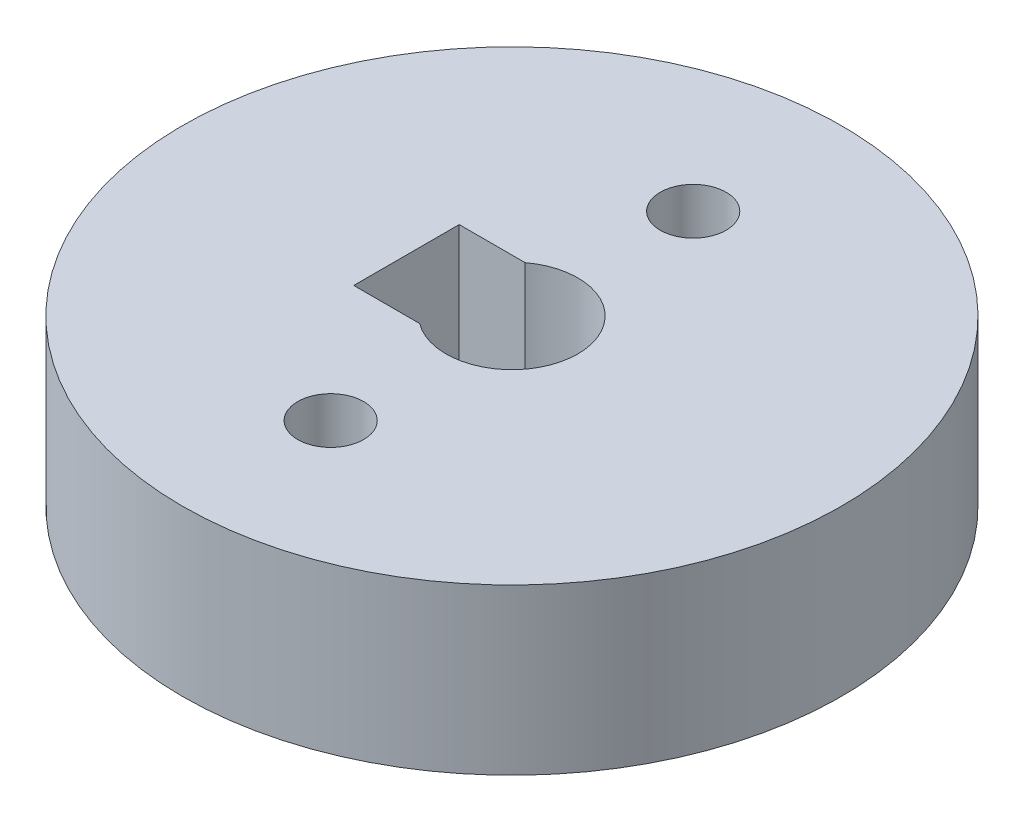
ISO-10303-21;
HEADER;
FILE_DESCRIPTION(('STEP AP214'),'2;1');
FILE_NAME('part.step','',(''),(''),'','','');
FILE_SCHEMA(('AUTOMOTIVE_DESIGN { 1 0 10303 214 1 1 1 1 }'));
ENDSEC;
DATA;
#1=APPLICATION_CONTEXT('core data for automotive mechanical design processes');
#2=APPLICATION_PROTOCOL_DEFINITION('international standard','automotive_design',2000,#1);
#3=PRODUCT_CONTEXT('',#1,'mechanical');
#4=PRODUCT('Part','Part','',(#3));
#5=PRODUCT_RELATED_PRODUCT_CATEGORY('part','',(#4));
#6=PRODUCT_DEFINITION_FORMATION('','',#4);
#7=PRODUCT_DEFINITION_CONTEXT('part definition',#1,'design');
#8=PRODUCT_DEFINITION('design','',#6,#7);
#9=PRODUCT_DEFINITION_SHAPE('','',#8);
#10=(LENGTH_UNIT() NAMED_UNIT(*) SI_UNIT(.MILLI.,.METRE.));
#11=(NAMED_UNIT(*) PLANE_ANGLE_UNIT() SI_UNIT($,.RADIAN.));
#12=(NAMED_UNIT(*) SI_UNIT($,.STERADIAN.) SOLID_ANGLE_UNIT());
#13=UNCERTAINTY_MEASURE_WITH_UNIT(LENGTH_MEASURE(1.E-05),#10,'distance_accuracy_value','');
#14=(GEOMETRIC_REPRESENTATION_CONTEXT(3) GLOBAL_UNCERTAINTY_ASSIGNED_CONTEXT((#13)) GLOBAL_UNIT_ASSIGNED_CONTEXT((#10,
#11,#12)) REPRESENTATION_CONTEXT('',''));
#15=CARTESIAN_POINT('',(0.,0.,0.));
#16=DIRECTION('',(0.,0.,1.));
#17=DIRECTION('',(1.,0.,0.));
#18=AXIS2_PLACEMENT_3D('',#15,#16,#17);
#19=CARTESIAN_POINT('',(0.,5.,0.));
#20=DIRECTION('',(0.,-1.,0.));
#21=DIRECTION('',(0.,0.,-1.));
#22=AXIS2_PLACEMENT_3D('',#19,#20,#21);
#23=CYLINDRICAL_SURFACE('',#22,2.);
#24=CARTESIAN_POINT('',(0.,0.,0.));
#25=DIRECTION('',(0.,1.,0.));
#26=DIRECTION('',(0.,0.,1.));
#27=AXIS2_PLACEMENT_3D('',#24,#25,#26);
#28=CIRCLE('',#27,2.);
#29=CARTESIAN_POINT('',(-1.2,0.,1.6));
#30=VERTEX_POINT('',#29);
#31=CARTESIAN_POINT('',(-1.19999999999999,0.,-1.59999999999999));
#32=VERTEX_POINT('',#31);
#33=EDGE_CURVE('E113',#30,#32,#28,.T.);
#34=ORIENTED_EDGE('',*,*,#33,.F.);
#35=DIRECTION('',(0.,-1.,0.));
#36=VECTOR('',#35,1.);
#37=CARTESIAN_POINT('',(-1.2,5.,1.6));
#38=LINE('',#37,#36);
#39=CARTESIAN_POINT('',(-1.2,5.,1.6));
#40=VERTEX_POINT('',#39);
#41=EDGE_CURVE('E11',#40,#30,#38,.T.);
#42=ORIENTED_EDGE('',*,*,#41,.F.);
#43=CARTESIAN_POINT('',(0.,5.,0.));
#44=DIRECTION('',(0.,1.,0.));
#45=DIRECTION('',(0.,0.,1.));
#46=AXIS2_PLACEMENT_3D('',#43,#44,#45);
#47=CIRCLE('',#46,2.);
#48=CARTESIAN_POINT('',(-1.19999999999999,5.,-1.59999999999999));
#49=VERTEX_POINT('',#48);
#50=EDGE_CURVE('E93',#40,#49,#47,.T.);
#51=ORIENTED_EDGE('',*,*,#50,.T.);
#52=DIRECTION('',(0.,-1.,0.));
#53=VECTOR('',#52,1.);
#54=CARTESIAN_POINT('',(-1.19999999999999,5.,-1.59999999999999));
#55=LINE('',#54,#53);
#56=EDGE_CURVE('E81',#49,#32,#55,.T.);
#57=ORIENTED_EDGE('',*,*,#56,.T.);
#58=EDGE_LOOP('',(#34,#42,#51,#57));
#59=FACE_BOUND('',#58,.T.);
#60=ADVANCED_FACE('F41',(#59),#23,.F.);
#61=CARTESIAN_POINT('',(0.,5.,1.6));
#62=DIRECTION('',(0.,0.,1.));
#63=DIRECTION('',(1.,0.,0.));
#64=AXIS2_PLACEMENT_3D('',#61,#62,#63);
#65=PLANE('',#64);
#66=DIRECTION('',(-1.,0.,0.));
#67=VECTOR('',#66,1.);
#68=CARTESIAN_POINT('',(0.,0.,1.6));
#69=LINE('',#68,#67);
#70=CARTESIAN_POINT('',(-3.2,0.,1.59999999999999));
#71=VERTEX_POINT('',#70);
#72=EDGE_CURVE('E99',#30,#71,#69,.T.);
#73=ORIENTED_EDGE('',*,*,#72,.T.);
#74=DIRECTION('',(0.,-1.,0.));
#75=VECTOR('',#74,1.);
#76=CARTESIAN_POINT('',(-3.2,5.,1.59999999999999));
#77=LINE('',#76,#75);
#78=CARTESIAN_POINT('',(-3.2,5.,1.59999999999999));
#79=VERTEX_POINT('',#78);
#80=EDGE_CURVE('E50',#79,#71,#77,.T.);
#81=ORIENTED_EDGE('',*,*,#80,.F.);
#82=DIRECTION('',(-1.,0.,0.));
#83=VECTOR('',#82,1.);
#84=CARTESIAN_POINT('',(0.,5.,1.6));
#85=LINE('',#84,#83);
#86=EDGE_CURVE('E87',#40,#79,#85,.T.);
#87=ORIENTED_EDGE('',*,*,#86,.F.);
#88=ORIENTED_EDGE('',*,*,#41,.T.);
#89=EDGE_LOOP('',(#73,#81,#87,#88));
#90=FACE_BOUND('',#89,.T.);
#91=ADVANCED_FACE('F97',(#90),#65,.F.);
#92=CARTESIAN_POINT('',(-3.19999999999999,5.,0.));
#93=DIRECTION('',(-1.,0.,0.));
#94=DIRECTION('',(0.,0.,1.));
#95=AXIS2_PLACEMENT_3D('',#92,#93,#94);
#96=PLANE('',#95);
#97=DIRECTION('',(0.,0.,-1.));
#98=VECTOR('',#97,1.);
#99=CARTESIAN_POINT('',(-3.19999999999999,0.,0.));
#100=LINE('',#99,#98);
#101=CARTESIAN_POINT('',(-3.19999999999999,0.,-1.6));
#102=VERTEX_POINT('',#101);
#103=EDGE_CURVE('E74',#71,#102,#100,.T.);
#104=ORIENTED_EDGE('',*,*,#103,.T.);
#105=DIRECTION('',(0.,-1.,0.));
#106=VECTOR('',#105,1.);
#107=CARTESIAN_POINT('',(-3.19999999999999,5.,-1.6));
#108=LINE('',#107,#106);
#109=CARTESIAN_POINT('',(-3.19999999999999,5.,-1.6));
#110=VERTEX_POINT('',#109);
#111=EDGE_CURVE('E101',#110,#102,#108,.T.);
#112=ORIENTED_EDGE('',*,*,#111,.F.);
#113=DIRECTION('',(0.,0.,-1.));
#114=VECTOR('',#113,1.);
#115=CARTESIAN_POINT('',(-3.19999999999999,5.,0.));
#116=LINE('',#115,#114);
#117=EDGE_CURVE('E92',#79,#110,#116,.T.);
#118=ORIENTED_EDGE('',*,*,#117,.F.);
#119=ORIENTED_EDGE('',*,*,#80,.T.);
#120=EDGE_LOOP('',(#104,#112,#118,#119));
#121=FACE_BOUND('',#120,.T.);
#122=ADVANCED_FACE('F102',(#121),#96,.F.);
#123=CARTESIAN_POINT('',(0.,5.,-1.59999999999999));
#124=DIRECTION('',(0.,0.,-1.));
#125=DIRECTION('',(-1.,0.,0.));
#126=AXIS2_PLACEMENT_3D('',#123,#124,#125);
#127=PLANE('',#126);
#128=DIRECTION('',(1.,0.,0.));
#129=VECTOR('',#128,1.);
#130=CARTESIAN_POINT('',(0.,0.,-1.59999999999999));
#131=LINE('',#130,#129);
#132=EDGE_CURVE('E122',#102,#32,#131,.T.);
#133=ORIENTED_EDGE('',*,*,#132,.T.);
#134=ORIENTED_EDGE('',*,*,#56,.F.);
#135=DIRECTION('',(1.,0.,0.));
#136=VECTOR('',#135,1.);
#137=CARTESIAN_POINT('',(0.,5.,-1.59999999999999));
#138=LINE('',#137,#136);
#139=EDGE_CURVE('E58',#110,#49,#138,.T.);
#140=ORIENTED_EDGE('',*,*,#139,.F.);
#141=ORIENTED_EDGE('',*,*,#111,.T.);
#142=EDGE_LOOP('',(#133,#134,#140,#141));
#143=FACE_BOUND('',#142,.T.);
#144=ADVANCED_FACE('F134',(#143),#127,.F.);
#145=CARTESIAN_POINT('',(0.,5.,0.));
#146=DIRECTION('',(0.,-1.,0.));
#147=DIRECTION('',(0.,0.,-1.));
#148=AXIS2_PLACEMENT_3D('',#145,#146,#147);
#149=CYLINDRICAL_SURFACE('',#148,10.);
#150=CARTESIAN_POINT('',(0.,5.,0.));
#151=DIRECTION('',(0.,1.,0.));
#152=DIRECTION('',(0.,0.,1.));
#153=AXIS2_PLACEMENT_3D('',#150,#151,#152);
#154=CIRCLE('',#153,10.);
#155=CARTESIAN_POINT('',(0.,5.,10.));
#156=VERTEX_POINT('',#155);
#157=EDGE_CURVE('E106',#156,#156,#154,.T.);
#158=ORIENTED_EDGE('',*,*,#157,.F.);
#159=EDGE_LOOP('',(#158));
#160=FACE_BOUND('',#159,.T.);
#161=CARTESIAN_POINT('',(0.,0.,0.));
#162=DIRECTION('',(0.,1.,0.));
#163=DIRECTION('',(0.,0.,1.));
#164=AXIS2_PLACEMENT_3D('',#161,#162,#163);
#165=CIRCLE('',#164,10.);
#166=CARTESIAN_POINT('',(0.,0.,10.));
#167=VERTEX_POINT('',#166);
#168=EDGE_CURVE('E125',#167,#167,#165,.T.);
#169=ORIENTED_EDGE('',*,*,#168,.T.);
#170=EDGE_LOOP('',(#169));
#171=FACE_BOUND('',#170,.T.);
#172=ADVANCED_FACE('F149',(#160,#171),#149,.T.);
#173=CARTESIAN_POINT('',(0.,5.,0.));
#174=DIRECTION('',(0.,1.,0.));
#175=DIRECTION('',(0.,0.,1.));
#176=AXIS2_PLACEMENT_3D('',#173,#174,#175);
#177=PLANE('',#176);
#178=CARTESIAN_POINT('',(0.,5.,5.5));
#179=DIRECTION('',(0.,1.,0.));
#180=DIRECTION('',(0.,0.,1.));
#181=AXIS2_PLACEMENT_3D('',#178,#179,#180);
#182=CIRCLE('',#181,1.00000000000001);
#183=CARTESIAN_POINT('',(0.,5.,6.50000000000001));
#184=VERTEX_POINT('',#183);
#185=EDGE_CURVE('E174',#184,#184,#182,.T.);
#186=ORIENTED_EDGE('',*,*,#185,.F.);
#187=EDGE_LOOP('',(#186));
#188=FACE_BOUND('',#187,.T.);
#189=CARTESIAN_POINT('',(0.,5.,-5.5));
#190=DIRECTION('',(0.,1.,0.));
#191=DIRECTION('',(0.,0.,1.));
#192=AXIS2_PLACEMENT_3D('',#189,#190,#191);
#193=CIRCLE('',#192,1.00000000000001);
#194=CARTESIAN_POINT('',(0.,5.,-4.49999999999999));
#195=VERTEX_POINT('',#194);
#196=EDGE_CURVE('E178',#195,#195,#193,.T.);
#197=ORIENTED_EDGE('',*,*,#196,.F.);
#198=EDGE_LOOP('',(#197));
#199=FACE_BOUND('',#198,.T.);
#200=ORIENTED_EDGE('',*,*,#50,.F.);
#201=ORIENTED_EDGE('',*,*,#86,.T.);
#202=ORIENTED_EDGE('',*,*,#117,.T.);
#203=ORIENTED_EDGE('',*,*,#139,.T.);
#204=EDGE_LOOP('',(#200,#201,#202,#203));
#205=FACE_BOUND('',#204,.T.);
#206=ORIENTED_EDGE('',*,*,#157,.T.);
#207=EDGE_LOOP('',(#206));
#208=FACE_BOUND('',#207,.T.);
#209=ADVANCED_FACE('F89',(#188,#199,#205,#208),#177,.T.);
#210=CARTESIAN_POINT('',(0.,0.,0.));
#211=DIRECTION('',(0.,1.,0.));
#212=DIRECTION('',(0.,0.,1.));
#213=AXIS2_PLACEMENT_3D('',#210,#211,#212);
#214=PLANE('',#213);
#215=CARTESIAN_POINT('',(0.,0.,5.5));
#216=DIRECTION('',(0.,1.,0.));
#217=DIRECTION('',(0.,0.,1.));
#218=AXIS2_PLACEMENT_3D('',#215,#216,#217);
#219=CIRCLE('',#218,1.00000000000001);
#220=CARTESIAN_POINT('',(0.,0.,6.50000000000001));
#221=VERTEX_POINT('',#220);
#222=EDGE_CURVE('E171',#221,#221,#219,.T.);
#223=ORIENTED_EDGE('',*,*,#222,.T.);
#224=EDGE_LOOP('',(#223));
#225=FACE_BOUND('',#224,.T.);
#226=CARTESIAN_POINT('',(0.,0.,-5.5));
#227=DIRECTION('',(0.,1.,0.));
#228=DIRECTION('',(0.,0.,1.));
#229=AXIS2_PLACEMENT_3D('',#226,#227,#228);
#230=CIRCLE('',#229,1.00000000000001);
#231=CARTESIAN_POINT('',(0.,0.,-4.49999999999999));
#232=VERTEX_POINT('',#231);
#233=EDGE_CURVE('E117',#232,#232,#230,.T.);
#234=ORIENTED_EDGE('',*,*,#233,.T.);
#235=EDGE_LOOP('',(#234));
#236=FACE_BOUND('',#235,.T.);
#237=ORIENTED_EDGE('',*,*,#33,.T.);
#238=ORIENTED_EDGE('',*,*,#132,.F.);
#239=ORIENTED_EDGE('',*,*,#103,.F.);
#240=ORIENTED_EDGE('',*,*,#72,.F.);
#241=EDGE_LOOP('',(#237,#238,#239,#240));
#242=FACE_BOUND('',#241,.T.);
#243=ORIENTED_EDGE('',*,*,#168,.F.);
#244=EDGE_LOOP('',(#243));
#245=FACE_BOUND('',#244,.T.);
#246=ADVANCED_FACE('F136',(#225,#236,#242,#245),#214,.F.);
#247=CARTESIAN_POINT('',(0.,5.,-5.5));
#248=DIRECTION('',(0.,1.,0.));
#249=DIRECTION('',(0.,0.,1.));
#250=AXIS2_PLACEMENT_3D('',#247,#248,#249);
#251=CYLINDRICAL_SURFACE('',#250,1.00000000000001);
#252=ORIENTED_EDGE('',*,*,#233,.F.);
#253=EDGE_LOOP('',(#252));
#254=FACE_BOUND('',#253,.T.);
#255=ORIENTED_EDGE('',*,*,#196,.T.);
#256=EDGE_LOOP('',(#255));
#257=FACE_BOUND('',#256,.T.);
#258=ADVANCED_FACE('F155',(#254,#257),#251,.F.);
#259=CARTESIAN_POINT('',(0.,5.,5.5));
#260=DIRECTION('',(0.,1.,0.));
#261=DIRECTION('',(0.,0.,1.));
#262=AXIS2_PLACEMENT_3D('',#259,#260,#261);
#263=CYLINDRICAL_SURFACE('',#262,1.00000000000001);
#264=ORIENTED_EDGE('',*,*,#222,.F.);
#265=EDGE_LOOP('',(#264));
#266=FACE_BOUND('',#265,.T.);
#267=ORIENTED_EDGE('',*,*,#185,.T.);
#268=EDGE_LOOP('',(#267));
#269=FACE_BOUND('',#268,.T.);
#270=ADVANCED_FACE('F162',(#266,#269),#263,.F.);
#271=CLOSED_SHELL('',(#60,#91,#122,#144,#172,#209,#246,#258,#270));
#272=MANIFOLD_SOLID_BREP('B2',#271);
#273=ADVANCED_BREP_SHAPE_REPRESENTATION('',(#18,#272),#14);
#274=SHAPE_DEFINITION_REPRESENTATION(#9,#273);
ENDSEC;
END-ISO-10303-21;
